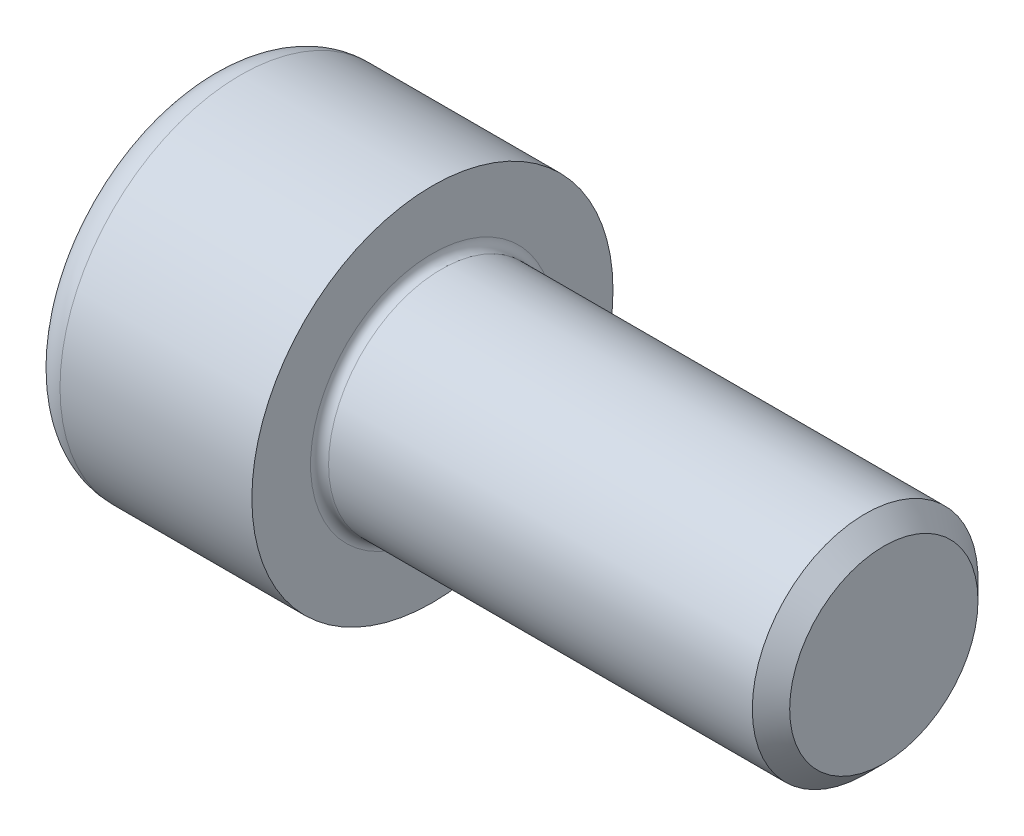
ISO-10303-21;
HEADER;
FILE_DESCRIPTION(('STEP AP214'),'2;1');
FILE_NAME('part.step','',(''),(''),'','','');
FILE_SCHEMA(('AUTOMOTIVE_DESIGN { 1 0 10303 214 1 1 1 1 }'));
ENDSEC;
DATA;
#1=APPLICATION_CONTEXT('core data for automotive mechanical design processes');
#2=APPLICATION_PROTOCOL_DEFINITION('international standard','automotive_design',2000,#1);
#3=PRODUCT_CONTEXT('',#1,'mechanical');
#4=PRODUCT('Part','Part','',(#3));
#5=PRODUCT_RELATED_PRODUCT_CATEGORY('part','',(#4));
#6=PRODUCT_DEFINITION_FORMATION('','',#4);
#7=PRODUCT_DEFINITION_CONTEXT('part definition',#1,'design');
#8=PRODUCT_DEFINITION('design','',#6,#7);
#9=PRODUCT_DEFINITION_SHAPE('','',#8);
#10=(LENGTH_UNIT() NAMED_UNIT(*) SI_UNIT(.MILLI.,.METRE.));
#11=(NAMED_UNIT(*) PLANE_ANGLE_UNIT() SI_UNIT($,.RADIAN.));
#12=(NAMED_UNIT(*) SI_UNIT($,.STERADIAN.) SOLID_ANGLE_UNIT());
#13=UNCERTAINTY_MEASURE_WITH_UNIT(LENGTH_MEASURE(1.E-05),#10,'distance_accuracy_value','');
#14=(GEOMETRIC_REPRESENTATION_CONTEXT(3) GLOBAL_UNCERTAINTY_ASSIGNED_CONTEXT((#13)) GLOBAL_UNIT_ASSIGNED_CONTEXT((#10,
#11,#12)) REPRESENTATION_CONTEXT('',''));
#15=CARTESIAN_POINT('',(0.,0.,0.));
#16=DIRECTION('',(0.,0.,1.));
#17=DIRECTION('',(1.,0.,0.));
#18=AXIS2_PLACEMENT_3D('',#15,#16,#17);
#19=CARTESIAN_POINT('',(0.,0.,0.));
#20=DIRECTION('',(-1.,0.,0.));
#21=DIRECTION('',(0.,0.,1.));
#22=AXIS2_PLACEMENT_3D('',#19,#20,#21);
#23=PLANE('',#22);
#24=DIRECTION('',(0.,-0.499999999999999,0.866025403784439));
#25=VECTOR('',#24,1.);
#26=CARTESIAN_POINT('',(0.,4.68519743447381,0.));
#27=LINE('',#26,#25);
#28=CARTESIAN_POINT('',(0.,4.68519743447381,0.));
#29=VERTEX_POINT('',#28);
#30=CARTESIAN_POINT('',(0.,2.34259871723691,4.05749999999999));
#31=VERTEX_POINT('',#30);
#32=EDGE_CURVE('E263',#29,#31,#27,.T.);
#33=ORIENTED_EDGE('',*,*,#32,.T.);
#34=DIRECTION('',(0.,1.,0.));
#35=VECTOR('',#34,1.);
#36=CARTESIAN_POINT('',(0.,-2.3425987172369,4.0575));
#37=LINE('',#36,#35);
#38=CARTESIAN_POINT('',(0.,-2.3425987172369,4.0575));
#39=VERTEX_POINT('',#38);
#40=EDGE_CURVE('E135',#39,#31,#37,.T.);
#41=ORIENTED_EDGE('',*,*,#40,.F.);
#42=DIRECTION('',(0.,-0.500000000000001,-0.866025403784438));
#43=VECTOR('',#42,1.);
#44=CARTESIAN_POINT('',(0.,-2.3425987172369,4.0575));
#45=LINE('',#44,#43);
#46=CARTESIAN_POINT('',(0.,-4.68519743447382,0.));
#47=VERTEX_POINT('',#46);
#48=EDGE_CURVE('E266',#39,#47,#45,.T.);
#49=ORIENTED_EDGE('',*,*,#48,.T.);
#50=DIRECTION('',(0.,0.499999999999999,-0.866025403784439));
#51=VECTOR('',#50,1.);
#52=CARTESIAN_POINT('',(0.,-4.68519743447382,0.));
#53=LINE('',#52,#51);
#54=CARTESIAN_POINT('',(0.,-2.34259871723692,-4.0575));
#55=VERTEX_POINT('',#54);
#56=EDGE_CURVE('E269',#47,#55,#53,.T.);
#57=ORIENTED_EDGE('',*,*,#56,.T.);
#58=DIRECTION('',(0.,-1.,0.));
#59=VECTOR('',#58,1.);
#60=CARTESIAN_POINT('',(0.,2.3425987172369,-4.05750000000001));
#61=LINE('',#60,#59);
#62=CARTESIAN_POINT('',(0.,2.3425987172369,-4.05750000000001));
#63=VERTEX_POINT('',#62);
#64=EDGE_CURVE('E272',#63,#55,#61,.T.);
#65=ORIENTED_EDGE('',*,*,#64,.F.);
#66=DIRECTION('',(0.,-0.500000000000001,-0.866025403784438));
#67=VECTOR('',#66,1.);
#68=CARTESIAN_POINT('',(0.,4.68519743447381,0.));
#69=LINE('',#68,#67);
#70=EDGE_CURVE('E130',#29,#63,#69,.T.);
#71=ORIENTED_EDGE('',*,*,#70,.F.);
#72=EDGE_LOOP('',(#33,#41,#49,#57,#65,#71));
#73=FACE_BOUND('',#72,.T.);
#74=CARTESIAN_POINT('',(0.,0.,0.));
#75=DIRECTION('',(-1.,0.,0.));
#76=DIRECTION('',(0.,0.,1.));
#77=AXIS2_PLACEMENT_3D('',#74,#75,#76);
#78=CIRCLE('',#77,6.5);
#79=CARTESIAN_POINT('',(0.,0.,6.5));
#80=VERTEX_POINT('',#79);
#81=EDGE_CURVE('E47',#80,#80,#78,.T.);
#82=ORIENTED_EDGE('',*,*,#81,.T.);
#83=EDGE_LOOP('',(#82));
#84=FACE_BOUND('',#83,.T.);
#85=ADVANCED_FACE('F39',(#73,#84),#23,.T.);
#86=CARTESIAN_POINT('',(-31.75,0.,0.));
#87=DIRECTION('',(-1.,0.,0.));
#88=DIRECTION('',(0.,0.,1.));
#89=AXIS2_PLACEMENT_3D('',#86,#87,#88);
#90=CYLINDRICAL_SURFACE('',#89,8.);
#91=CARTESIAN_POINT('',(1.5,0.,0.));
#92=DIRECTION('',(-1.,0.,0.));
#93=DIRECTION('',(0.,0.,1.));
#94=AXIS2_PLACEMENT_3D('',#91,#92,#93);
#95=CIRCLE('',#94,8.);
#96=CARTESIAN_POINT('',(1.5,0.,8.));
#97=VERTEX_POINT('',#96);
#98=EDGE_CURVE('E11',#97,#97,#95,.F.);
#99=ORIENTED_EDGE('',*,*,#98,.T.);
#100=EDGE_LOOP('',(#99));
#101=FACE_BOUND('',#100,.T.);
#102=CARTESIAN_POINT('',(10.,0.,0.));
#103=DIRECTION('',(-1.,0.,0.));
#104=DIRECTION('',(0.,0.,1.));
#105=AXIS2_PLACEMENT_3D('',#102,#103,#104);
#106=CIRCLE('',#105,8.);
#107=CARTESIAN_POINT('',(10.,0.,8.));
#108=VERTEX_POINT('',#107);
#109=EDGE_CURVE('E153',#108,#108,#106,.T.);
#110=ORIENTED_EDGE('',*,*,#109,.T.);
#111=EDGE_LOOP('',(#110));
#112=FACE_BOUND('',#111,.T.);
#113=ADVANCED_FACE('F177',(#101,#112),#90,.T.);
#114=CARTESIAN_POINT('',(10.,8.,0.));
#115=DIRECTION('',(1.,0.,0.));
#116=DIRECTION('',(0.,0.,-1.));
#117=AXIS2_PLACEMENT_3D('',#114,#115,#116);
#118=PLANE('',#117);
#119=CARTESIAN_POINT('',(10.,0.,0.));
#120=DIRECTION('',(1.,0.,0.));
#121=DIRECTION('',(0.,0.,-1.));
#122=AXIS2_PLACEMENT_3D('',#119,#120,#121);
#123=CIRCLE('',#122,5.4);
#124=CARTESIAN_POINT('',(10.,0.,-5.4));
#125=VERTEX_POINT('',#124);
#126=EDGE_CURVE('E156',#125,#125,#123,.F.);
#127=ORIENTED_EDGE('',*,*,#126,.T.);
#128=EDGE_LOOP('',(#127));
#129=FACE_BOUND('',#128,.T.);
#130=ORIENTED_EDGE('',*,*,#109,.F.);
#131=EDGE_LOOP('',(#130));
#132=FACE_BOUND('',#131,.T.);
#133=ADVANCED_FACE('F183',(#129,#132),#118,.T.);
#134=CARTESIAN_POINT('',(-31.75,0.,0.));
#135=DIRECTION('',(-1.,0.,0.));
#136=DIRECTION('',(0.,0.,1.));
#137=AXIS2_PLACEMENT_3D('',#134,#135,#136);
#138=CYLINDRICAL_SURFACE('',#137,5.);
#139=CARTESIAN_POINT('',(10.4,0.,0.));
#140=DIRECTION('',(1.,0.,0.));
#141=DIRECTION('',(0.,0.,-1.));
#142=AXIS2_PLACEMENT_3D('',#139,#140,#141);
#143=CIRCLE('',#142,5.);
#144=CARTESIAN_POINT('',(10.4,0.,-5.));
#145=VERTEX_POINT('',#144);
#146=EDGE_CURVE('E159',#145,#145,#143,.T.);
#147=ORIENTED_EDGE('',*,*,#146,.T.);
#148=EDGE_LOOP('',(#147));
#149=FACE_BOUND('',#148,.T.);
#150=CARTESIAN_POINT('',(29.172,0.,0.));
#151=DIRECTION('',(-1.,0.,0.));
#152=DIRECTION('',(0.,0.,1.));
#153=AXIS2_PLACEMENT_3D('',#150,#151,#152);
#154=CIRCLE('',#153,5.);
#155=CARTESIAN_POINT('',(29.172,0.,5.));
#156=VERTEX_POINT('',#155);
#157=EDGE_CURVE('E150',#156,#156,#154,.T.);
#158=ORIENTED_EDGE('',*,*,#157,.T.);
#159=EDGE_LOOP('',(#158));
#160=FACE_BOUND('',#159,.T.);
#161=ADVANCED_FACE('F189',(#149,#160),#138,.T.);
#162=CARTESIAN_POINT('',(30.,0.,0.));
#163=DIRECTION('',(-1.,0.,0.));
#164=DIRECTION('',(0.,0.,1.));
#165=AXIS2_PLACEMENT_3D('',#162,#163,#164);
#166=CONICAL_SURFACE('',#165,4.172,0.78539816339745);
#167=ORIENTED_EDGE('',*,*,#157,.F.);
#168=EDGE_LOOP('',(#167));
#169=FACE_BOUND('',#168,.T.);
#170=CARTESIAN_POINT('',(30.,0.,0.));
#171=DIRECTION('',(-1.,0.,0.));
#172=DIRECTION('',(0.,0.,1.));
#173=AXIS2_PLACEMENT_3D('',#170,#171,#172);
#174=CIRCLE('',#173,4.172);
#175=CARTESIAN_POINT('',(30.,0.,4.172));
#176=VERTEX_POINT('',#175);
#177=EDGE_CURVE('E146',#176,#176,#174,.T.);
#178=ORIENTED_EDGE('',*,*,#177,.T.);
#179=EDGE_LOOP('',(#178));
#180=FACE_BOUND('',#179,.T.);
#181=ADVANCED_FACE('F193',(#169,#180),#166,.T.);
#182=CARTESIAN_POINT('',(30.,4.172,0.));
#183=DIRECTION('',(1.,0.,0.));
#184=DIRECTION('',(0.,0.,-1.));
#185=AXIS2_PLACEMENT_3D('',#182,#183,#184);
#186=PLANE('',#185);
#187=ORIENTED_EDGE('',*,*,#177,.F.);
#188=EDGE_LOOP('',(#187));
#189=FACE_BOUND('',#188,.T.);
#190=ADVANCED_FACE('F173',(#189),#186,.T.);
#191=CARTESIAN_POINT('',(10.4,0.,0.));
#192=DIRECTION('',(1.,0.,0.));
#193=DIRECTION('',(0.,0.,-1.));
#194=AXIS2_PLACEMENT_3D('',#191,#192,#193);
#195=TOROIDAL_SURFACE('',#194,5.4,0.4);
#196=ORIENTED_EDGE('',*,*,#146,.F.);
#197=EDGE_LOOP('',(#196));
#198=FACE_BOUND('',#197,.T.);
#199=ORIENTED_EDGE('',*,*,#126,.F.);
#200=EDGE_LOOP('',(#199));
#201=FACE_BOUND('',#200,.T.);
#202=ADVANCED_FACE('F166',(#198,#201),#195,.F.);
#203=CARTESIAN_POINT('',(1.5,0.,0.));
#204=DIRECTION('',(-1.,0.,0.));
#205=DIRECTION('',(0.,0.,1.));
#206=AXIS2_PLACEMENT_3D('',#203,#204,#205);
#207=TOROIDAL_SURFACE('',#206,6.5,1.5);
#208=ORIENTED_EDGE('',*,*,#98,.F.);
#209=EDGE_LOOP('',(#208));
#210=FACE_BOUND('',#209,.T.);
#211=ORIENTED_EDGE('',*,*,#81,.F.);
#212=EDGE_LOOP('',(#211));
#213=FACE_BOUND('',#212,.T.);
#214=ADVANCED_FACE('F41',(#210,#213),#207,.T.);
#215=CARTESIAN_POINT('',(5.,4.68519743447381,0.));
#216=DIRECTION('',(0.,-0.866025403784439,-0.499999999999999));
#217=DIRECTION('',(0.,0.499999999999999,-0.866025403784439));
#218=AXIS2_PLACEMENT_3D('',#215,#216,#217);
#219=PLANE('',#218);
#220=ORIENTED_EDGE('',*,*,#32,.F.);
#221=DIRECTION('',(-1.,0.,0.));
#222=VECTOR('',#221,1.);
#223=CARTESIAN_POINT('',(5.,4.68519743447381,0.));
#224=LINE('',#223,#222);
#225=CARTESIAN_POINT('',(5.,4.68519743447381,0.));
#226=VERTEX_POINT('',#225);
#227=EDGE_CURVE('E253',#226,#29,#224,.T.);
#228=ORIENTED_EDGE('',*,*,#227,.F.);
#229=DIRECTION('',(0.,-0.499999999999999,0.866025403784439));
#230=VECTOR('',#229,1.);
#231=CARTESIAN_POINT('',(5.,4.68519743447381,0.));
#232=LINE('',#231,#230);
#233=CARTESIAN_POINT('',(5.,3.51389807585536,2.02874999999999));
#234=VERTEX_POINT('',#233);
#235=EDGE_CURVE('E122',#226,#234,#232,.T.);
#236=ORIENTED_EDGE('',*,*,#235,.T.);
#237=CARTESIAN_POINT('',(5.,2.34259871723691,4.05749999999999));
#238=VERTEX_POINT('',#237);
#239=EDGE_CURVE('E113',#234,#238,#232,.T.);
#240=ORIENTED_EDGE('',*,*,#239,.T.);
#241=DIRECTION('',(-1.,0.,0.));
#242=VECTOR('',#241,1.);
#243=CARTESIAN_POINT('',(5.,2.34259871723691,4.05749999999999));
#244=LINE('',#243,#242);
#245=EDGE_CURVE('E127',#238,#31,#244,.T.);
#246=ORIENTED_EDGE('',*,*,#245,.T.);
#247=EDGE_LOOP('',(#220,#228,#236,#240,#246));
#248=FACE_BOUND('',#247,.T.);
#249=ADVANCED_FACE('F126',(#248),#219,.T.);
#250=CARTESIAN_POINT('',(5.,-2.3425987172369,4.0575));
#251=DIRECTION('',(0.,0.,1.));
#252=DIRECTION('',(0.,-1.,0.));
#253=AXIS2_PLACEMENT_3D('',#250,#251,#252);
#254=PLANE('',#253);
#255=ORIENTED_EDGE('',*,*,#40,.T.);
#256=ORIENTED_EDGE('',*,*,#245,.F.);
#257=DIRECTION('',(0.,1.,0.));
#258=VECTOR('',#257,1.);
#259=CARTESIAN_POINT('',(5.,-2.3425987172369,4.0575));
#260=LINE('',#259,#258);
#261=CARTESIAN_POINT('',(5.,0.,4.0575));
#262=VERTEX_POINT('',#261);
#263=EDGE_CURVE('E110',#262,#238,#260,.T.);
#264=ORIENTED_EDGE('',*,*,#263,.F.);
#265=CARTESIAN_POINT('',(5.,-2.3425987172369,4.0575));
#266=VERTEX_POINT('',#265);
#267=EDGE_CURVE('E121',#266,#262,#260,.T.);
#268=ORIENTED_EDGE('',*,*,#267,.F.);
#269=DIRECTION('',(-1.,0.,0.));
#270=VECTOR('',#269,1.);
#271=CARTESIAN_POINT('',(5.,-2.3425987172369,4.0575));
#272=LINE('',#271,#270);
#273=EDGE_CURVE('E137',#266,#39,#272,.T.);
#274=ORIENTED_EDGE('',*,*,#273,.T.);
#275=EDGE_LOOP('',(#255,#256,#264,#268,#274));
#276=FACE_BOUND('',#275,.T.);
#277=ADVANCED_FACE('F132',(#276),#254,.F.);
#278=CARTESIAN_POINT('',(5.,-2.3425987172369,4.0575));
#279=DIRECTION('',(0.,0.866025403784438,-0.500000000000001));
#280=DIRECTION('',(0.,0.500000000000001,0.866025403784438));
#281=AXIS2_PLACEMENT_3D('',#278,#279,#280);
#282=PLANE('',#281);
#283=ORIENTED_EDGE('',*,*,#48,.F.);
#284=ORIENTED_EDGE('',*,*,#273,.F.);
#285=DIRECTION('',(0.,-0.500000000000001,-0.866025403784438));
#286=VECTOR('',#285,1.);
#287=CARTESIAN_POINT('',(5.,-2.3425987172369,4.0575));
#288=LINE('',#287,#286);
#289=CARTESIAN_POINT('',(5.,-3.51389807585536,2.02875000000001));
#290=VERTEX_POINT('',#289);
#291=EDGE_CURVE('E292',#266,#290,#288,.T.);
#292=ORIENTED_EDGE('',*,*,#291,.T.);
#293=CARTESIAN_POINT('',(5.,-4.68519743447382,0.));
#294=VERTEX_POINT('',#293);
#295=EDGE_CURVE('E281',#290,#294,#288,.T.);
#296=ORIENTED_EDGE('',*,*,#295,.T.);
#297=DIRECTION('',(-1.,0.,0.));
#298=VECTOR('',#297,1.);
#299=CARTESIAN_POINT('',(5.,-4.68519743447382,0.));
#300=LINE('',#299,#298);
#301=EDGE_CURVE('E142',#294,#47,#300,.T.);
#302=ORIENTED_EDGE('',*,*,#301,.T.);
#303=EDGE_LOOP('',(#283,#284,#292,#296,#302));
#304=FACE_BOUND('',#303,.T.);
#305=ADVANCED_FACE('F207',(#304),#282,.T.);
#306=CARTESIAN_POINT('',(5.,-4.68519743447382,0.));
#307=DIRECTION('',(0.,0.866025403784439,0.499999999999999));
#308=DIRECTION('',(0.,-0.499999999999999,0.866025403784439));
#309=AXIS2_PLACEMENT_3D('',#306,#307,#308);
#310=PLANE('',#309);
#311=ORIENTED_EDGE('',*,*,#56,.F.);
#312=ORIENTED_EDGE('',*,*,#301,.F.);
#313=DIRECTION('',(0.,0.499999999999999,-0.866025403784439));
#314=VECTOR('',#313,1.);
#315=CARTESIAN_POINT('',(5.,-4.68519743447382,0.));
#316=LINE('',#315,#314);
#317=CARTESIAN_POINT('',(5.,-3.51389807585537,-2.02875));
#318=VERTEX_POINT('',#317);
#319=EDGE_CURVE('E259',#294,#318,#316,.T.);
#320=ORIENTED_EDGE('',*,*,#319,.T.);
#321=CARTESIAN_POINT('',(5.,-2.34259871723692,-4.0575));
#322=VERTEX_POINT('',#321);
#323=EDGE_CURVE('E291',#318,#322,#316,.T.);
#324=ORIENTED_EDGE('',*,*,#323,.T.);
#325=DIRECTION('',(-1.,0.,0.));
#326=VECTOR('',#325,1.);
#327=CARTESIAN_POINT('',(5.,-2.34259871723692,-4.0575));
#328=LINE('',#327,#326);
#329=EDGE_CURVE('E252',#322,#55,#328,.T.);
#330=ORIENTED_EDGE('',*,*,#329,.T.);
#331=EDGE_LOOP('',(#311,#312,#320,#324,#330));
#332=FACE_BOUND('',#331,.T.);
#333=ADVANCED_FACE('F210',(#332),#310,.T.);
#334=CARTESIAN_POINT('',(5.,2.3425987172369,-4.05750000000001));
#335=DIRECTION('',(0.,0.,-1.));
#336=DIRECTION('',(0.,1.,0.));
#337=AXIS2_PLACEMENT_3D('',#334,#335,#336);
#338=PLANE('',#337);
#339=ORIENTED_EDGE('',*,*,#64,.T.);
#340=ORIENTED_EDGE('',*,*,#329,.F.);
#341=DIRECTION('',(0.,-1.,0.));
#342=VECTOR('',#341,1.);
#343=CARTESIAN_POINT('',(5.,2.3425987172369,-4.05750000000001));
#344=LINE('',#343,#342);
#345=CARTESIAN_POINT('',(5.,0.,-4.0575));
#346=VERTEX_POINT('',#345);
#347=EDGE_CURVE('E256',#346,#322,#344,.T.);
#348=ORIENTED_EDGE('',*,*,#347,.F.);
#349=CARTESIAN_POINT('',(5.,2.3425987172369,-4.05750000000001));
#350=VERTEX_POINT('',#349);
#351=EDGE_CURVE('E54',#350,#346,#344,.T.);
#352=ORIENTED_EDGE('',*,*,#351,.F.);
#353=DIRECTION('',(-1.,0.,0.));
#354=VECTOR('',#353,1.);
#355=CARTESIAN_POINT('',(5.,2.3425987172369,-4.05750000000001));
#356=LINE('',#355,#354);
#357=EDGE_CURVE('E249',#350,#63,#356,.T.);
#358=ORIENTED_EDGE('',*,*,#357,.T.);
#359=EDGE_LOOP('',(#339,#340,#348,#352,#358));
#360=FACE_BOUND('',#359,.T.);
#361=ADVANCED_FACE('F214',(#360),#338,.F.);
#362=CARTESIAN_POINT('',(5.,4.68519743447381,0.));
#363=DIRECTION('',(0.,0.866025403784438,-0.500000000000001));
#364=DIRECTION('',(0.,0.500000000000001,0.866025403784438));
#365=AXIS2_PLACEMENT_3D('',#362,#363,#364);
#366=PLANE('',#365);
#367=ORIENTED_EDGE('',*,*,#70,.T.);
#368=ORIENTED_EDGE('',*,*,#357,.F.);
#369=DIRECTION('',(0.,-0.500000000000001,-0.866025403784438));
#370=VECTOR('',#369,1.);
#371=CARTESIAN_POINT('',(5.,4.68519743447381,0.));
#372=LINE('',#371,#370);
#373=CARTESIAN_POINT('',(5.,3.51389807585536,-2.02875));
#374=VERTEX_POINT('',#373);
#375=EDGE_CURVE('E239',#374,#350,#372,.T.);
#376=ORIENTED_EDGE('',*,*,#375,.F.);
#377=EDGE_CURVE('E245',#226,#374,#372,.T.);
#378=ORIENTED_EDGE('',*,*,#377,.F.);
#379=ORIENTED_EDGE('',*,*,#227,.T.);
#380=EDGE_LOOP('',(#367,#368,#376,#378,#379));
#381=FACE_BOUND('',#380,.T.);
#382=ADVANCED_FACE('F218',(#381),#366,.F.);
#383=CARTESIAN_POINT('',(5.,7.02779615171071,-4.05750000000001));
#384=DIRECTION('',(1.,0.,0.));
#385=DIRECTION('',(0.,0.,-1.));
#386=AXIS2_PLACEMENT_3D('',#383,#384,#385);
#387=PLANE('',#386);
#388=ORIENTED_EDGE('',*,*,#347,.T.);
#389=ORIENTED_EDGE('',*,*,#323,.F.);
#390=CARTESIAN_POINT('',(5.,0.,0.));
#391=DIRECTION('',(-1.,0.,0.));
#392=DIRECTION('',(0.,0.,1.));
#393=AXIS2_PLACEMENT_3D('',#390,#391,#392);
#394=CIRCLE('',#393,4.0575);
#395=EDGE_CURVE('E287',#346,#318,#394,.T.);
#396=ORIENTED_EDGE('',*,*,#395,.F.);
#397=EDGE_LOOP('',(#388,#389,#396));
#398=FACE_BOUND('',#397,.T.);
#399=ADVANCED_FACE('F222',(#398),#387,.F.);
#400=ORIENTED_EDGE('',*,*,#319,.F.);
#401=ORIENTED_EDGE('',*,*,#295,.F.);
#402=EDGE_CURVE('E140',#318,#290,#394,.T.);
#403=ORIENTED_EDGE('',*,*,#402,.F.);
#404=EDGE_LOOP('',(#400,#401,#403));
#405=FACE_BOUND('',#404,.T.);
#406=ADVANCED_FACE('F225',(#405),#387,.F.);
#407=ORIENTED_EDGE('',*,*,#291,.F.);
#408=ORIENTED_EDGE('',*,*,#267,.T.);
#409=EDGE_CURVE('E136',#290,#262,#394,.T.);
#410=ORIENTED_EDGE('',*,*,#409,.F.);
#411=EDGE_LOOP('',(#407,#408,#410));
#412=FACE_BOUND('',#411,.T.);
#413=ADVANCED_FACE('F230',(#412),#387,.F.);
#414=ORIENTED_EDGE('',*,*,#263,.T.);
#415=ORIENTED_EDGE('',*,*,#239,.F.);
#416=EDGE_CURVE('E116',#262,#234,#394,.T.);
#417=ORIENTED_EDGE('',*,*,#416,.F.);
#418=EDGE_LOOP('',(#414,#415,#417));
#419=FACE_BOUND('',#418,.T.);
#420=ADVANCED_FACE('F112',(#419),#387,.F.);
#421=ORIENTED_EDGE('',*,*,#235,.F.);
#422=ORIENTED_EDGE('',*,*,#377,.T.);
#423=EDGE_CURVE('E147',#234,#374,#394,.T.);
#424=ORIENTED_EDGE('',*,*,#423,.F.);
#425=EDGE_LOOP('',(#421,#422,#424));
#426=FACE_BOUND('',#425,.T.);
#427=ADVANCED_FACE('F233',(#426),#387,.F.);
#428=ORIENTED_EDGE('',*,*,#375,.T.);
#429=ORIENTED_EDGE('',*,*,#351,.T.);
#430=EDGE_CURVE('E242',#374,#346,#394,.T.);
#431=ORIENTED_EDGE('',*,*,#430,.F.);
#432=EDGE_LOOP('',(#428,#429,#431));
#433=FACE_BOUND('',#432,.T.);
#434=ADVANCED_FACE('F203',(#433),#387,.F.);
#435=CARTESIAN_POINT('',(5.,0.,0.));
#436=DIRECTION('',(-1.,0.,0.));
#437=DIRECTION('',(0.,0.,1.));
#438=AXIS2_PLACEMENT_3D('',#435,#436,#437);
#439=CONICAL_SURFACE('',#438,4.0575,1.04719755119659);
#440=CARTESIAN_POINT('',(7.34259871723693,0.,0.));
#441=VERTEX_POINT('',#440);
#442=VERTEX_LOOP('',#441);
#443=FACE_BOUND('',#442,.T.);
#444=ORIENTED_EDGE('',*,*,#416,.T.);
#445=ORIENTED_EDGE('',*,*,#423,.T.);
#446=ORIENTED_EDGE('',*,*,#430,.T.);
#447=ORIENTED_EDGE('',*,*,#395,.T.);
#448=ORIENTED_EDGE('',*,*,#402,.T.);
#449=ORIENTED_EDGE('',*,*,#409,.T.);
#450=EDGE_LOOP('',(#444,#445,#446,#447,#448,#449));
#451=FACE_BOUND('',#450,.T.);
#452=ADVANCED_FACE('F201',(#443,#451),#439,.F.);
#453=CLOSED_SHELL('',(#85,#113,#133,#161,#181,#190,#202,#214,#249,#277,#305,#333,#361,#382,#399,
#406,#413,#420,#427,#434,#452));
#454=MANIFOLD_SOLID_BREP('B2',#453);
#455=ADVANCED_BREP_SHAPE_REPRESENTATION('',(#18,#454),#14);
#456=SHAPE_DEFINITION_REPRESENTATION(#9,#455);
ENDSEC;
END-ISO-10303-21;
